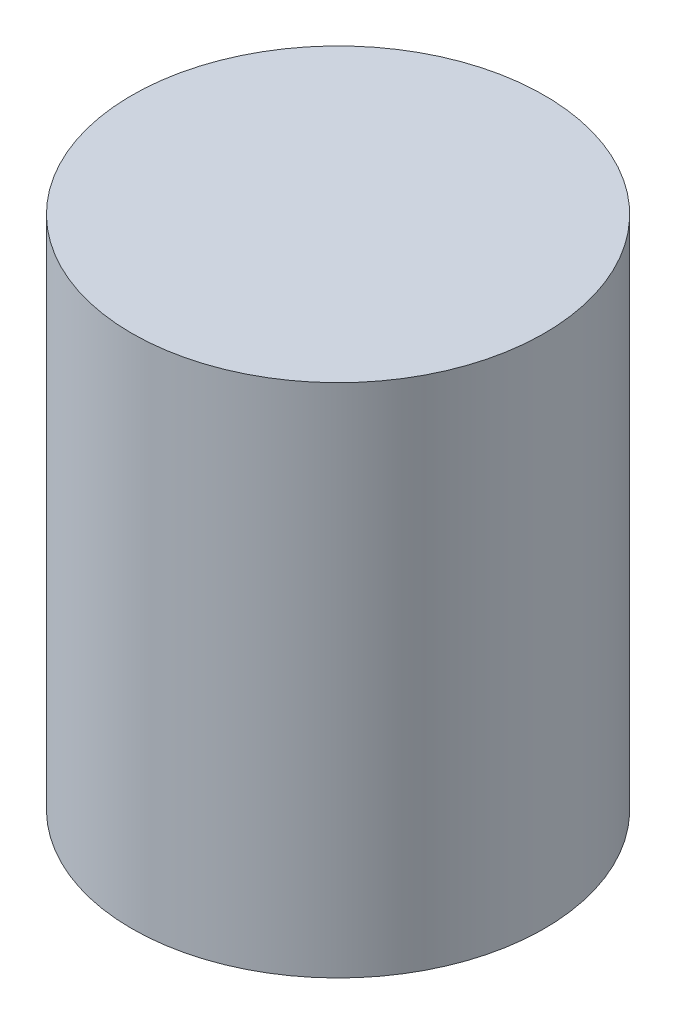
ISO-10303-21;
HEADER;
FILE_DESCRIPTION(('STEP AP214'),'2;1');
FILE_NAME('part.step','',(''),(''),'','','');
FILE_SCHEMA(('AUTOMOTIVE_DESIGN { 1 0 10303 214 1 1 1 1 }'));
ENDSEC;
DATA;
#1=APPLICATION_CONTEXT('core data for automotive mechanical design processes');
#2=APPLICATION_PROTOCOL_DEFINITION('international standard','automotive_design',2000,#1);
#3=PRODUCT_CONTEXT('',#1,'mechanical');
#4=PRODUCT('Part','Part','',(#3));
#5=PRODUCT_RELATED_PRODUCT_CATEGORY('part','',(#4));
#6=PRODUCT_DEFINITION_FORMATION('','',#4);
#7=PRODUCT_DEFINITION_CONTEXT('part definition',#1,'design');
#8=PRODUCT_DEFINITION('design','',#6,#7);
#9=PRODUCT_DEFINITION_SHAPE('','',#8);
#10=(LENGTH_UNIT() NAMED_UNIT(*) SI_UNIT(.MILLI.,.METRE.));
#11=(NAMED_UNIT(*) PLANE_ANGLE_UNIT() SI_UNIT($,.RADIAN.));
#12=(NAMED_UNIT(*) SI_UNIT($,.STERADIAN.) SOLID_ANGLE_UNIT());
#13=UNCERTAINTY_MEASURE_WITH_UNIT(LENGTH_MEASURE(1.E-05),#10,'distance_accuracy_value','');
#14=(GEOMETRIC_REPRESENTATION_CONTEXT(3) GLOBAL_UNCERTAINTY_ASSIGNED_CONTEXT((#13)) GLOBAL_UNIT_ASSIGNED_CONTEXT((#10,
#11,#12)) REPRESENTATION_CONTEXT('',''));
#15=CARTESIAN_POINT('',(0.,0.,0.));
#16=DIRECTION('',(0.,0.,1.));
#17=DIRECTION('',(1.,0.,0.));
#18=AXIS2_PLACEMENT_3D('',#15,#16,#17);
#19=CARTESIAN_POINT('',(40.,50.6542056074766,0.));
#20=DIRECTION('',(0.,-1.,0.));
#21=DIRECTION('',(0.,0.,-1.));
#22=AXIS2_PLACEMENT_3D('',#19,#20,#21);
#23=PLANE('',#22);
#24=CARTESIAN_POINT('',(0.,50.6542056074766,0.));
#25=DIRECTION('',(0.,1.,0.));
#26=DIRECTION('',(0.,0.,1.));
#27=AXIS2_PLACEMENT_3D('',#24,#25,#26);
#28=CIRCLE('',#27,40.);
#29=CARTESIAN_POINT('',(0.,50.6542056074766,40.));
#30=VERTEX_POINT('',#29);
#31=EDGE_CURVE('E44',#30,#30,#28,.T.);
#32=ORIENTED_EDGE('',*,*,#31,.T.);
#33=EDGE_LOOP('',(#32));
#34=FACE_BOUND('',#33,.T.);
#35=ADVANCED_FACE('F37',(#34),#23,.F.);
#36=CARTESIAN_POINT('',(0.,-49.3457943925234,0.));
#37=DIRECTION('',(0.,1.,0.));
#38=DIRECTION('',(0.,0.,1.));
#39=AXIS2_PLACEMENT_3D('',#36,#37,#38);
#40=PLANE('',#39);
#41=CARTESIAN_POINT('',(0.,-49.3457943925234,0.));
#42=DIRECTION('',(0.,1.,0.));
#43=DIRECTION('',(0.,0.,1.));
#44=AXIS2_PLACEMENT_3D('',#41,#42,#43);
#45=CIRCLE('',#44,40.);
#46=CARTESIAN_POINT('',(0.,-49.3457943925234,40.));
#47=VERTEX_POINT('',#46);
#48=EDGE_CURVE('E10',#47,#47,#45,.T.);
#49=ORIENTED_EDGE('',*,*,#48,.F.);
#50=EDGE_LOOP('',(#49));
#51=FACE_BOUND('',#50,.T.);
#52=ADVANCED_FACE('F54',(#51),#40,.F.);
#53=CARTESIAN_POINT('',(0.,50.6542056074766,0.));
#54=DIRECTION('',(0.,1.,0.));
#55=DIRECTION('',(0.,0.,1.));
#56=AXIS2_PLACEMENT_3D('',#53,#54,#55);
#57=CYLINDRICAL_SURFACE('',#56,40.);
#58=ORIENTED_EDGE('',*,*,#31,.F.);
#59=EDGE_LOOP('',(#58));
#60=FACE_BOUND('',#59,.T.);
#61=ORIENTED_EDGE('',*,*,#48,.T.);
#62=EDGE_LOOP('',(#61));
#63=FACE_BOUND('',#62,.T.);
#64=ADVANCED_FACE('F52',(#60,#63),#57,.T.);
#65=CLOSED_SHELL('',(#35,#52,#64));
#66=MANIFOLD_SOLID_BREP('B2',#65);
#67=ADVANCED_BREP_SHAPE_REPRESENTATION('',(#18,#66),#14);
#68=SHAPE_DEFINITION_REPRESENTATION(#9,#67);
ENDSEC;
END-ISO-10303-21;
